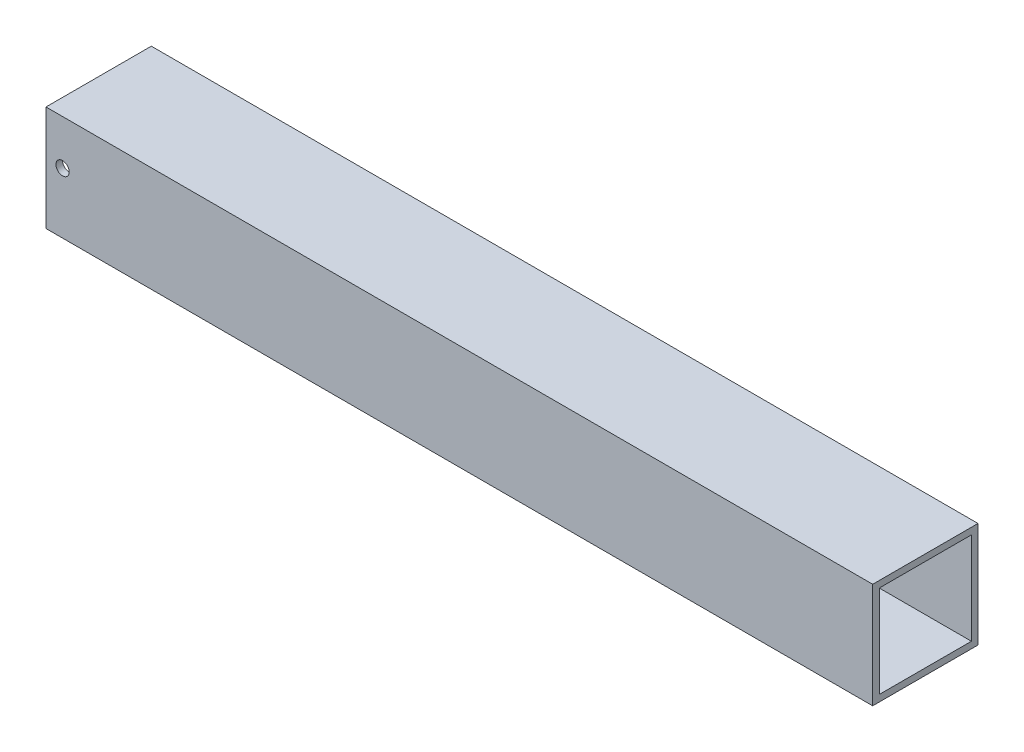
ISO-10303-21;
HEADER;
FILE_DESCRIPTION(('STEP AP214'),'2;1');
FILE_NAME('part.step','',(''),(''),'','','');
FILE_SCHEMA(('AUTOMOTIVE_DESIGN { 1 0 10303 214 1 1 1 1 }'));
ENDSEC;
DATA;
#1=APPLICATION_CONTEXT('core data for automotive mechanical design processes');
#2=APPLICATION_PROTOCOL_DEFINITION('international standard','automotive_design',2000,#1);
#3=PRODUCT_CONTEXT('',#1,'mechanical');
#4=PRODUCT('Part','Part','',(#3));
#5=PRODUCT_RELATED_PRODUCT_CATEGORY('part','',(#4));
#6=PRODUCT_DEFINITION_FORMATION('','',#4);
#7=PRODUCT_DEFINITION_CONTEXT('part definition',#1,'design');
#8=PRODUCT_DEFINITION('design','',#6,#7);
#9=PRODUCT_DEFINITION_SHAPE('','',#8);
#10=(LENGTH_UNIT() NAMED_UNIT(*) SI_UNIT(.MILLI.,.METRE.));
#11=(NAMED_UNIT(*) PLANE_ANGLE_UNIT() SI_UNIT($,.RADIAN.));
#12=(NAMED_UNIT(*) SI_UNIT($,.STERADIAN.) SOLID_ANGLE_UNIT());
#13=UNCERTAINTY_MEASURE_WITH_UNIT(LENGTH_MEASURE(1.E-05),#10,'distance_accuracy_value','');
#14=(GEOMETRIC_REPRESENTATION_CONTEXT(3) GLOBAL_UNCERTAINTY_ASSIGNED_CONTEXT((#13)) GLOBAL_UNIT_ASSIGNED_CONTEXT((#10,
#11,#12)) REPRESENTATION_CONTEXT('',''));
#15=CARTESIAN_POINT('',(0.,0.,0.));
#16=DIRECTION('',(0.,0.,1.));
#17=DIRECTION('',(1.,0.,0.));
#18=AXIS2_PLACEMENT_3D('',#15,#16,#17);
#19=CARTESIAN_POINT('',(-325.990437485714,0.,-12.7));
#20=DIRECTION('',(0.,0.,1.));
#21=DIRECTION('',(0.,-1.,0.));
#22=AXIS2_PLACEMENT_3D('',#19,#20,#21);
#23=PLANE('',#22);
#24=CARTESIAN_POINT('',(-321.990437485714,3.79750000000007,-12.7));
#25=DIRECTION('',(0.,0.,1.));
#26=DIRECTION('',(0.,-1.,0.));
#27=AXIS2_PLACEMENT_3D('',#24,#25,#26);
#28=CIRCLE('',#27,1.59999999999999);
#29=CARTESIAN_POINT('',(-321.990437485714,2.19750000000008,-12.7));
#30=VERTEX_POINT('',#29);
#31=EDGE_CURVE('E192',#30,#30,#28,.T.);
#32=ORIENTED_EDGE('',*,*,#31,.T.);
#33=EDGE_LOOP('',(#32));
#34=FACE_BOUND('',#33,.T.);
#35=DIRECTION('',(0.,-1.,0.));
#36=VECTOR('',#35,1.);
#37=CARTESIAN_POINT('',(-126.589562514286,0.,-12.7));
#38=LINE('',#37,#36);
#39=CARTESIAN_POINT('',(-126.589562514286,14.59875,-12.7));
#40=VERTEX_POINT('',#39);
#41=CARTESIAN_POINT('',(-126.589562514286,-10.80125,-12.7));
#42=VERTEX_POINT('',#41);
#43=EDGE_CURVE('E144',#40,#42,#38,.T.);
#44=ORIENTED_EDGE('',*,*,#43,.T.);
#45=DIRECTION('',(1.,0.,0.));
#46=VECTOR('',#45,1.);
#47=CARTESIAN_POINT('',(-325.990437485714,-10.80125,-12.7));
#48=LINE('',#47,#46);
#49=CARTESIAN_POINT('',(-325.990437485714,-10.80125,-12.7));
#50=VERTEX_POINT('',#49);
#51=EDGE_CURVE('E11',#50,#42,#48,.T.);
#52=ORIENTED_EDGE('',*,*,#51,.F.);
#53=DIRECTION('',(0.,-1.,0.));
#54=VECTOR('',#53,1.);
#55=CARTESIAN_POINT('',(-325.990437485714,0.,-12.7));
#56=LINE('',#55,#54);
#57=CARTESIAN_POINT('',(-325.990437485714,14.59875,-12.7));
#58=VERTEX_POINT('',#57);
#59=EDGE_CURVE('E56',#58,#50,#56,.T.);
#60=ORIENTED_EDGE('',*,*,#59,.F.);
#61=DIRECTION('',(1.,0.,0.));
#62=VECTOR('',#61,1.);
#63=CARTESIAN_POINT('',(-325.990437485714,14.59875,-12.7));
#64=LINE('',#63,#62);
#65=EDGE_CURVE('E118',#58,#40,#64,.T.);
#66=ORIENTED_EDGE('',*,*,#65,.T.);
#67=EDGE_LOOP('',(#44,#52,#60,#66));
#68=FACE_BOUND('',#67,.T.);
#69=ADVANCED_FACE('F37',(#34,#68),#23,.F.);
#70=CARTESIAN_POINT('',(-325.990437485714,-10.80125,0.));
#71=DIRECTION('',(0.,-1.,0.));
#72=DIRECTION('',(0.,0.,-1.));
#73=AXIS2_PLACEMENT_3D('',#70,#71,#72);
#74=PLANE('',#73);
#75=DIRECTION('',(0.,0.,-1.));
#76=VECTOR('',#75,1.);
#77=CARTESIAN_POINT('',(-126.589562514286,-10.80125,0.));
#78=LINE('',#77,#76);
#79=CARTESIAN_POINT('',(-126.589562514286,-10.80125,12.7));
#80=VERTEX_POINT('',#79);
#81=EDGE_CURVE('E149',#80,#42,#78,.T.);
#82=ORIENTED_EDGE('',*,*,#81,.F.);
#83=DIRECTION('',(1.,0.,0.));
#84=VECTOR('',#83,1.);
#85=CARTESIAN_POINT('',(-325.990437485714,-10.80125,12.7));
#86=LINE('',#85,#84);
#87=CARTESIAN_POINT('',(-325.990437485714,-10.80125,12.7));
#88=VERTEX_POINT('',#87);
#89=EDGE_CURVE('E47',#88,#80,#86,.T.);
#90=ORIENTED_EDGE('',*,*,#89,.F.);
#91=DIRECTION('',(0.,0.,-1.));
#92=VECTOR('',#91,1.);
#93=CARTESIAN_POINT('',(-325.990437485714,-10.80125,0.));
#94=LINE('',#93,#92);
#95=EDGE_CURVE('E126',#88,#50,#94,.T.);
#96=ORIENTED_EDGE('',*,*,#95,.T.);
#97=ORIENTED_EDGE('',*,*,#51,.T.);
#98=EDGE_LOOP('',(#82,#90,#96,#97));
#99=FACE_BOUND('',#98,.T.);
#100=ADVANCED_FACE('F213',(#99),#74,.T.);
#101=CARTESIAN_POINT('',(-325.990437485714,0.,12.7));
#102=DIRECTION('',(0.,0.,1.));
#103=DIRECTION('',(0.,-1.,0.));
#104=AXIS2_PLACEMENT_3D('',#101,#102,#103);
#105=PLANE('',#104);
#106=CARTESIAN_POINT('',(-321.990437485714,3.79750000000007,12.7));
#107=DIRECTION('',(0.,0.,1.));
#108=DIRECTION('',(0.,-1.,0.));
#109=AXIS2_PLACEMENT_3D('',#106,#107,#108);
#110=CIRCLE('',#109,1.59999999999999);
#111=CARTESIAN_POINT('',(-321.990437485714,2.19750000000008,12.7));
#112=VERTEX_POINT('',#111);
#113=EDGE_CURVE('E135',#112,#112,#110,.T.);
#114=ORIENTED_EDGE('',*,*,#113,.F.);
#115=EDGE_LOOP('',(#114));
#116=FACE_BOUND('',#115,.T.);
#117=DIRECTION('',(0.,-1.,0.));
#118=VECTOR('',#117,1.);
#119=CARTESIAN_POINT('',(-126.589562514286,0.,12.7));
#120=LINE('',#119,#118);
#121=CARTESIAN_POINT('',(-126.589562514286,14.59875,12.7));
#122=VERTEX_POINT('',#121);
#123=EDGE_CURVE('E115',#122,#80,#120,.T.);
#124=ORIENTED_EDGE('',*,*,#123,.F.);
#125=DIRECTION('',(1.,0.,0.));
#126=VECTOR('',#125,1.);
#127=CARTESIAN_POINT('',(-325.990437485714,14.59875,12.7));
#128=LINE('',#127,#126);
#129=CARTESIAN_POINT('',(-325.990437485714,14.59875,12.7));
#130=VERTEX_POINT('',#129);
#131=EDGE_CURVE('E110',#130,#122,#128,.T.);
#132=ORIENTED_EDGE('',*,*,#131,.F.);
#133=DIRECTION('',(0.,-1.,0.));
#134=VECTOR('',#133,1.);
#135=CARTESIAN_POINT('',(-325.990437485714,0.,12.7));
#136=LINE('',#135,#134);
#137=EDGE_CURVE('E114',#130,#88,#136,.T.);
#138=ORIENTED_EDGE('',*,*,#137,.T.);
#139=ORIENTED_EDGE('',*,*,#89,.T.);
#140=EDGE_LOOP('',(#124,#132,#138,#139));
#141=FACE_BOUND('',#140,.T.);
#142=ADVANCED_FACE('F112',(#116,#141),#105,.T.);
#143=CARTESIAN_POINT('',(-325.990437485714,0.,11.1125));
#144=DIRECTION('',(0.,0.,1.));
#145=DIRECTION('',(0.,-1.,0.));
#146=AXIS2_PLACEMENT_3D('',#143,#144,#145);
#147=PLANE('',#146);
#148=CARTESIAN_POINT('',(-321.990437485714,3.79750000000007,11.1125));
#149=DIRECTION('',(0.,0.,1.));
#150=DIRECTION('',(0.,-1.,0.));
#151=AXIS2_PLACEMENT_3D('',#148,#149,#150);
#152=CIRCLE('',#151,1.59999999999999);
#153=CARTESIAN_POINT('',(-321.990437485714,2.19750000000008,11.1125));
#154=VERTEX_POINT('',#153);
#155=EDGE_CURVE('E41',#154,#154,#152,.T.);
#156=ORIENTED_EDGE('',*,*,#155,.T.);
#157=EDGE_LOOP('',(#156));
#158=FACE_BOUND('',#157,.T.);
#159=DIRECTION('',(0.,-1.,0.));
#160=VECTOR('',#159,1.);
#161=CARTESIAN_POINT('',(-126.589562514286,0.,11.1125));
#162=LINE('',#161,#160);
#163=CARTESIAN_POINT('',(-126.589562514286,13.01125,11.1125));
#164=VERTEX_POINT('',#163);
#165=CARTESIAN_POINT('',(-126.589562514286,-9.21375,11.1125));
#166=VERTEX_POINT('',#165);
#167=EDGE_CURVE('E131',#164,#166,#162,.T.);
#168=ORIENTED_EDGE('',*,*,#167,.T.);
#169=DIRECTION('',(1.,0.,0.));
#170=VECTOR('',#169,1.);
#171=CARTESIAN_POINT('',(-325.990437485714,-9.21375,11.1125));
#172=LINE('',#171,#170);
#173=CARTESIAN_POINT('',(-325.990437485714,-9.21375,11.1125));
#174=VERTEX_POINT('',#173);
#175=EDGE_CURVE('E155',#174,#166,#172,.T.);
#176=ORIENTED_EDGE('',*,*,#175,.F.);
#177=DIRECTION('',(0.,-1.,0.));
#178=VECTOR('',#177,1.);
#179=CARTESIAN_POINT('',(-325.990437485714,0.,11.1125));
#180=LINE('',#179,#178);
#181=CARTESIAN_POINT('',(-325.990437485714,13.01125,11.1125));
#182=VERTEX_POINT('',#181);
#183=EDGE_CURVE('E151',#182,#174,#180,.T.);
#184=ORIENTED_EDGE('',*,*,#183,.F.);
#185=DIRECTION('',(1.,0.,0.));
#186=VECTOR('',#185,1.);
#187=CARTESIAN_POINT('',(-325.990437485714,13.01125,11.1125));
#188=LINE('',#187,#186);
#189=EDGE_CURVE('E97',#182,#164,#188,.T.);
#190=ORIENTED_EDGE('',*,*,#189,.T.);
#191=EDGE_LOOP('',(#168,#176,#184,#190));
#192=FACE_BOUND('',#191,.T.);
#193=ADVANCED_FACE('F39',(#158,#192),#147,.F.);
#194=CARTESIAN_POINT('',(-325.990437485714,-9.21375,0.));
#195=DIRECTION('',(0.,-1.,0.));
#196=DIRECTION('',(0.,0.,-1.));
#197=AXIS2_PLACEMENT_3D('',#194,#195,#196);
#198=PLANE('',#197);
#199=DIRECTION('',(0.,0.,-1.));
#200=VECTOR('',#199,1.);
#201=CARTESIAN_POINT('',(-126.589562514286,-9.21375,0.));
#202=LINE('',#201,#200);
#203=CARTESIAN_POINT('',(-126.589562514286,-9.21375,-11.1125));
#204=VERTEX_POINT('',#203);
#205=EDGE_CURVE('E141',#166,#204,#202,.T.);
#206=ORIENTED_EDGE('',*,*,#205,.T.);
#207=DIRECTION('',(1.,0.,0.));
#208=VECTOR('',#207,1.);
#209=CARTESIAN_POINT('',(-325.990437485714,-9.21375,-11.1125));
#210=LINE('',#209,#208);
#211=CARTESIAN_POINT('',(-325.990437485714,-9.21375,-11.1125));
#212=VERTEX_POINT('',#211);
#213=EDGE_CURVE('E158',#212,#204,#210,.T.);
#214=ORIENTED_EDGE('',*,*,#213,.F.);
#215=DIRECTION('',(0.,0.,-1.));
#216=VECTOR('',#215,1.);
#217=CARTESIAN_POINT('',(-325.990437485714,-9.21375,0.));
#218=LINE('',#217,#216);
#219=EDGE_CURVE('E180',#174,#212,#218,.T.);
#220=ORIENTED_EDGE('',*,*,#219,.F.);
#221=ORIENTED_EDGE('',*,*,#175,.T.);
#222=EDGE_LOOP('',(#206,#214,#220,#221));
#223=FACE_BOUND('',#222,.T.);
#224=ADVANCED_FACE('F179',(#223),#198,.F.);
#225=CARTESIAN_POINT('',(-325.990437485714,0.,-11.1125));
#226=DIRECTION('',(0.,0.,1.));
#227=DIRECTION('',(0.,-1.,0.));
#228=AXIS2_PLACEMENT_3D('',#225,#226,#227);
#229=PLANE('',#228);
#230=CARTESIAN_POINT('',(-321.990437485714,3.79750000000007,-11.1125));
#231=DIRECTION('',(0.,0.,1.));
#232=DIRECTION('',(0.,-1.,0.));
#233=AXIS2_PLACEMENT_3D('',#230,#231,#232);
#234=CIRCLE('',#233,1.59999999999999);
#235=CARTESIAN_POINT('',(-321.990437485714,2.19750000000008,-11.1125));
#236=VERTEX_POINT('',#235);
#237=EDGE_CURVE('E189',#236,#236,#234,.T.);
#238=ORIENTED_EDGE('',*,*,#237,.F.);
#239=EDGE_LOOP('',(#238));
#240=FACE_BOUND('',#239,.T.);
#241=DIRECTION('',(0.,-1.,0.));
#242=VECTOR('',#241,1.);
#243=CARTESIAN_POINT('',(-126.589562514286,0.,-11.1125));
#244=LINE('',#243,#242);
#245=CARTESIAN_POINT('',(-126.589562514286,13.01125,-11.1125));
#246=VERTEX_POINT('',#245);
#247=EDGE_CURVE('E138',#246,#204,#244,.T.);
#248=ORIENTED_EDGE('',*,*,#247,.F.);
#249=DIRECTION('',(1.,0.,0.));
#250=VECTOR('',#249,1.);
#251=CARTESIAN_POINT('',(-325.990437485714,13.01125,-11.1125));
#252=LINE('',#251,#250);
#253=CARTESIAN_POINT('',(-325.990437485714,13.01125,-11.1125));
#254=VERTEX_POINT('',#253);
#255=EDGE_CURVE('E160',#254,#246,#252,.T.);
#256=ORIENTED_EDGE('',*,*,#255,.F.);
#257=DIRECTION('',(0.,-1.,0.));
#258=VECTOR('',#257,1.);
#259=CARTESIAN_POINT('',(-325.990437485714,0.,-11.1125));
#260=LINE('',#259,#258);
#261=EDGE_CURVE('E177',#254,#212,#260,.T.);
#262=ORIENTED_EDGE('',*,*,#261,.T.);
#263=ORIENTED_EDGE('',*,*,#213,.T.);
#264=EDGE_LOOP('',(#248,#256,#262,#263));
#265=FACE_BOUND('',#264,.T.);
#266=ADVANCED_FACE('F175',(#240,#265),#229,.T.);
#267=CARTESIAN_POINT('',(-325.990437485714,13.01125,0.));
#268=DIRECTION('',(0.,-1.,0.));
#269=DIRECTION('',(0.,0.,-1.));
#270=AXIS2_PLACEMENT_3D('',#267,#268,#269);
#271=PLANE('',#270);
#272=DIRECTION('',(0.,0.,-1.));
#273=VECTOR('',#272,1.);
#274=CARTESIAN_POINT('',(-126.589562514286,13.01125,0.));
#275=LINE('',#274,#273);
#276=EDGE_CURVE('E134',#164,#246,#275,.T.);
#277=ORIENTED_EDGE('',*,*,#276,.F.);
#278=ORIENTED_EDGE('',*,*,#189,.F.);
#279=DIRECTION('',(0.,0.,-1.));
#280=VECTOR('',#279,1.);
#281=CARTESIAN_POINT('',(-325.990437485714,13.01125,0.));
#282=LINE('',#281,#280);
#283=EDGE_CURVE('E171',#182,#254,#282,.T.);
#284=ORIENTED_EDGE('',*,*,#283,.T.);
#285=ORIENTED_EDGE('',*,*,#255,.T.);
#286=EDGE_LOOP('',(#277,#278,#284,#285));
#287=FACE_BOUND('',#286,.T.);
#288=ADVANCED_FACE('F169',(#287),#271,.T.);
#289=CARTESIAN_POINT('',(-325.990437485714,14.59875,0.));
#290=DIRECTION('',(0.,-1.,0.));
#291=DIRECTION('',(0.,0.,-1.));
#292=AXIS2_PLACEMENT_3D('',#289,#290,#291);
#293=PLANE('',#292);
#294=DIRECTION('',(0.,0.,-1.));
#295=VECTOR('',#294,1.);
#296=CARTESIAN_POINT('',(-126.589562514286,14.59875,0.));
#297=LINE('',#296,#295);
#298=EDGE_CURVE('E146',#122,#40,#297,.T.);
#299=ORIENTED_EDGE('',*,*,#298,.T.);
#300=ORIENTED_EDGE('',*,*,#65,.F.);
#301=DIRECTION('',(0.,0.,-1.));
#302=VECTOR('',#301,1.);
#303=CARTESIAN_POINT('',(-325.990437485714,14.59875,0.));
#304=LINE('',#303,#302);
#305=EDGE_CURVE('E121',#130,#58,#304,.T.);
#306=ORIENTED_EDGE('',*,*,#305,.F.);
#307=ORIENTED_EDGE('',*,*,#131,.T.);
#308=EDGE_LOOP('',(#299,#300,#306,#307));
#309=FACE_BOUND('',#308,.T.);
#310=ADVANCED_FACE('F122',(#309),#293,.F.);
#311=CARTESIAN_POINT('',(-325.990437485714,0.,0.));
#312=DIRECTION('',(1.,0.,0.));
#313=DIRECTION('',(0.,0.,-1.));
#314=AXIS2_PLACEMENT_3D('',#311,#312,#313);
#315=PLANE('',#314);
#316=ORIENTED_EDGE('',*,*,#183,.T.);
#317=ORIENTED_EDGE('',*,*,#219,.T.);
#318=ORIENTED_EDGE('',*,*,#261,.F.);
#319=ORIENTED_EDGE('',*,*,#283,.F.);
#320=EDGE_LOOP('',(#316,#317,#318,#319));
#321=FACE_BOUND('',#320,.T.);
#322=ORIENTED_EDGE('',*,*,#59,.T.);
#323=ORIENTED_EDGE('',*,*,#95,.F.);
#324=ORIENTED_EDGE('',*,*,#137,.F.);
#325=ORIENTED_EDGE('',*,*,#305,.T.);
#326=EDGE_LOOP('',(#322,#323,#324,#325));
#327=FACE_BOUND('',#326,.T.);
#328=ADVANCED_FACE('F125',(#321,#327),#315,.F.);
#329=CARTESIAN_POINT('',(-126.589562514286,0.,0.));
#330=DIRECTION('',(1.,0.,0.));
#331=DIRECTION('',(0.,0.,-1.));
#332=AXIS2_PLACEMENT_3D('',#329,#330,#331);
#333=PLANE('',#332);
#334=ORIENTED_EDGE('',*,*,#167,.F.);
#335=ORIENTED_EDGE('',*,*,#276,.T.);
#336=ORIENTED_EDGE('',*,*,#247,.T.);
#337=ORIENTED_EDGE('',*,*,#205,.F.);
#338=EDGE_LOOP('',(#334,#335,#336,#337));
#339=FACE_BOUND('',#338,.T.);
#340=ORIENTED_EDGE('',*,*,#43,.F.);
#341=ORIENTED_EDGE('',*,*,#298,.F.);
#342=ORIENTED_EDGE('',*,*,#123,.T.);
#343=ORIENTED_EDGE('',*,*,#81,.T.);
#344=EDGE_LOOP('',(#340,#341,#342,#343));
#345=FACE_BOUND('',#344,.T.);
#346=ADVANCED_FACE('F167',(#339,#345),#333,.T.);
#347=CARTESIAN_POINT('',(-321.990437485714,3.79750000000007,15.05));
#348=DIRECTION('',(0.,0.,1.));
#349=DIRECTION('',(1.,0.,0.));
#350=AXIS2_PLACEMENT_3D('',#347,#348,#349);
#351=CYLINDRICAL_SURFACE('',#350,1.59999999999999);
#352=ORIENTED_EDGE('',*,*,#113,.T.);
#353=EDGE_LOOP('',(#352));
#354=FACE_BOUND('',#353,.T.);
#355=ORIENTED_EDGE('',*,*,#155,.F.);
#356=EDGE_LOOP('',(#355));
#357=FACE_BOUND('',#356,.T.);
#358=ADVANCED_FACE('F201',(#354,#357),#351,.F.);
#359=CARTESIAN_POINT('',(-321.990437485714,3.79750000000007,-15.05));
#360=DIRECTION('',(0.,0.,-1.));
#361=DIRECTION('',(1.,0.,0.));
#362=AXIS2_PLACEMENT_3D('',#359,#360,#361);
#363=CYLINDRICAL_SURFACE('',#362,1.59999999999999);
#364=ORIENTED_EDGE('',*,*,#31,.F.);
#365=EDGE_LOOP('',(#364));
#366=FACE_BOUND('',#365,.T.);
#367=ORIENTED_EDGE('',*,*,#237,.T.);
#368=EDGE_LOOP('',(#367));
#369=FACE_BOUND('',#368,.T.);
#370=ADVANCED_FACE('F198',(#366,#369),#363,.F.);
#371=CLOSED_SHELL('',(#69,#100,#142,#193,#224,#266,#288,#310,#328,#346,#358,#370));
#372=MANIFOLD_SOLID_BREP('B2',#371);
#373=ADVANCED_BREP_SHAPE_REPRESENTATION('',(#18,#372),#14);
#374=SHAPE_DEFINITION_REPRESENTATION(#9,#373);
ENDSEC;
END-ISO-10303-21;
